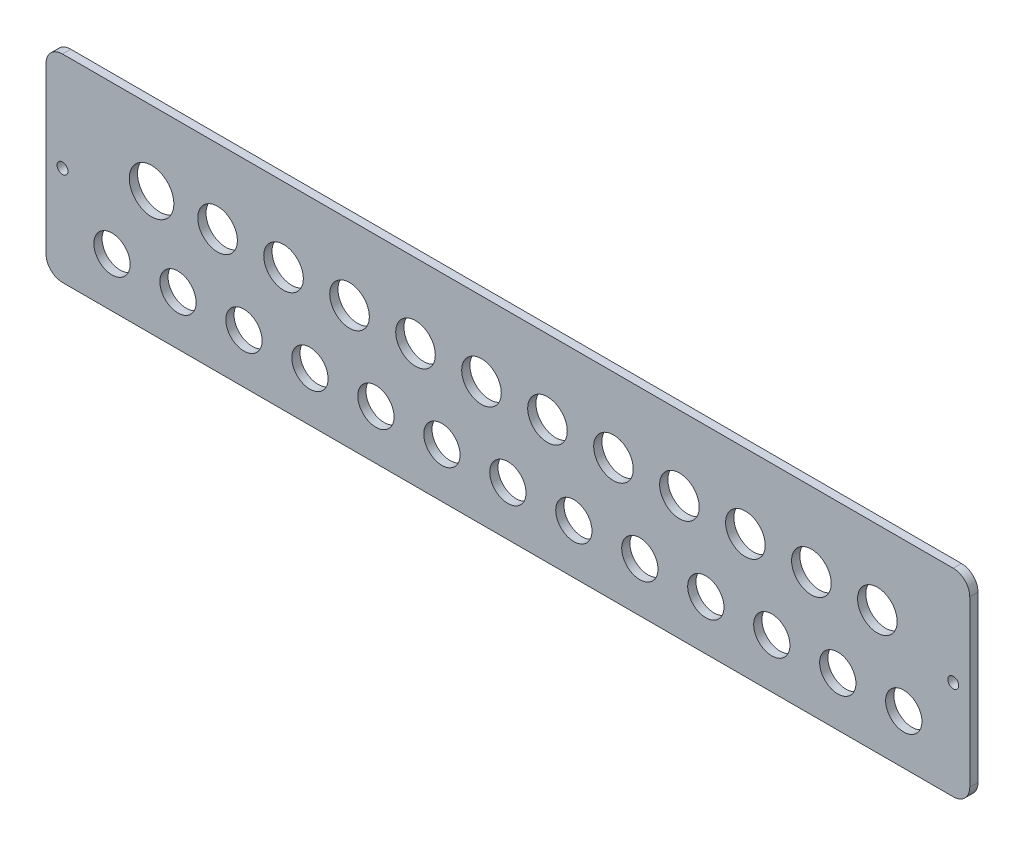
ISO-10303-21;
HEADER;
FILE_DESCRIPTION(('STEP AP214'),'2;1');
FILE_NAME('part.step','',(''),(''),'','','');
FILE_SCHEMA(('AUTOMOTIVE_DESIGN { 1 0 10303 214 1 1 1 1 }'));
ENDSEC;
DATA;
#1=APPLICATION_CONTEXT('core data for automotive mechanical design processes');
#2=APPLICATION_PROTOCOL_DEFINITION('international standard','automotive_design',2000,#1);
#3=PRODUCT_CONTEXT('',#1,'mechanical');
#4=PRODUCT('Part','Part','',(#3));
#5=PRODUCT_RELATED_PRODUCT_CATEGORY('part','',(#4));
#6=PRODUCT_DEFINITION_FORMATION('','',#4);
#7=PRODUCT_DEFINITION_CONTEXT('part definition',#1,'design');
#8=PRODUCT_DEFINITION('design','',#6,#7);
#9=PRODUCT_DEFINITION_SHAPE('','',#8);
#10=(LENGTH_UNIT() NAMED_UNIT(*) SI_UNIT(.MILLI.,.METRE.));
#11=(NAMED_UNIT(*) PLANE_ANGLE_UNIT() SI_UNIT($,.RADIAN.));
#12=(NAMED_UNIT(*) SI_UNIT($,.STERADIAN.) SOLID_ANGLE_UNIT());
#13=UNCERTAINTY_MEASURE_WITH_UNIT(LENGTH_MEASURE(1.E-05),#10,'distance_accuracy_value','');
#14=(GEOMETRIC_REPRESENTATION_CONTEXT(3) GLOBAL_UNCERTAINTY_ASSIGNED_CONTEXT((#13)) GLOBAL_UNIT_ASSIGNED_CONTEXT((#10,
#11,#12)) REPRESENTATION_CONTEXT('',''));
#15=CARTESIAN_POINT('',(0.,0.,0.));
#16=DIRECTION('',(0.,0.,1.));
#17=DIRECTION('',(1.,0.,0.));
#18=AXIS2_PLACEMENT_3D('',#15,#16,#17);
#19=CARTESIAN_POINT('',(270.,50.,5.));
#20=DIRECTION('',(0.,0.,-1.));
#21=DIRECTION('',(-1.,0.,0.));
#22=AXIS2_PLACEMENT_3D('',#19,#20,#21);
#23=CYLINDRICAL_SURFACE('',#22,10.);
#24=CARTESIAN_POINT('',(270.,50.,0.));
#25=DIRECTION('',(0.,0.,1.));
#26=DIRECTION('',(1.,0.,0.));
#27=AXIS2_PLACEMENT_3D('',#24,#25,#26);
#28=CIRCLE('',#27,10.);
#29=CARTESIAN_POINT('',(280.,50.,0.));
#30=VERTEX_POINT('',#29);
#31=CARTESIAN_POINT('',(270.,60.,0.));
#32=VERTEX_POINT('',#31);
#33=EDGE_CURVE('E132',#30,#32,#28,.T.);
#34=ORIENTED_EDGE('',*,*,#33,.T.);
#35=DIRECTION('',(0.,0.,-1.));
#36=VECTOR('',#35,1.);
#37=CARTESIAN_POINT('',(270.,60.,5.));
#38=LINE('',#37,#36);
#39=CARTESIAN_POINT('',(270.,60.,5.));
#40=VERTEX_POINT('',#39);
#41=EDGE_CURVE('E160',#40,#32,#38,.T.);
#42=ORIENTED_EDGE('',*,*,#41,.F.);
#43=CARTESIAN_POINT('',(270.,50.,5.));
#44=DIRECTION('',(0.,0.,1.));
#45=DIRECTION('',(1.,0.,0.));
#46=AXIS2_PLACEMENT_3D('',#43,#44,#45);
#47=CIRCLE('',#46,10.);
#48=CARTESIAN_POINT('',(280.,50.,5.));
#49=VERTEX_POINT('',#48);
#50=EDGE_CURVE('E147',#49,#40,#47,.T.);
#51=ORIENTED_EDGE('',*,*,#50,.F.);
#52=DIRECTION('',(0.,0.,-1.));
#53=VECTOR('',#52,1.);
#54=CARTESIAN_POINT('',(280.,50.,5.));
#55=LINE('',#54,#53);
#56=EDGE_CURVE('E128',#49,#30,#55,.T.);
#57=ORIENTED_EDGE('',*,*,#56,.T.);
#58=EDGE_LOOP('',(#34,#42,#51,#57));
#59=FACE_BOUND('',#58,.T.);
#60=ADVANCED_FACE('F33',(#59),#23,.T.);
#61=CARTESIAN_POINT('',(-270.,60.,5.));
#62=DIRECTION('',(0.,-1.,0.));
#63=DIRECTION('',(0.,0.,-1.));
#64=AXIS2_PLACEMENT_3D('',#61,#62,#63);
#65=PLANE('',#64);
#66=DIRECTION('',(-1.,0.,0.));
#67=VECTOR('',#66,1.);
#68=CARTESIAN_POINT('',(-270.,60.,0.));
#69=LINE('',#68,#67);
#70=CARTESIAN_POINT('',(-270.,60.,0.));
#71=VERTEX_POINT('',#70);
#72=EDGE_CURVE('E135',#32,#71,#69,.T.);
#73=ORIENTED_EDGE('',*,*,#72,.T.);
#74=DIRECTION('',(0.,0.,-1.));
#75=VECTOR('',#74,1.);
#76=CARTESIAN_POINT('',(-270.,60.,5.));
#77=LINE('',#76,#75);
#78=CARTESIAN_POINT('',(-270.,60.,5.));
#79=VERTEX_POINT('',#78);
#80=EDGE_CURVE('E157',#79,#71,#77,.T.);
#81=ORIENTED_EDGE('',*,*,#80,.F.);
#82=DIRECTION('',(-1.,0.,0.));
#83=VECTOR('',#82,1.);
#84=CARTESIAN_POINT('',(-270.,60.,5.));
#85=LINE('',#84,#83);
#86=EDGE_CURVE('E94',#40,#79,#85,.T.);
#87=ORIENTED_EDGE('',*,*,#86,.F.);
#88=ORIENTED_EDGE('',*,*,#41,.T.);
#89=EDGE_LOOP('',(#73,#81,#87,#88));
#90=FACE_BOUND('',#89,.T.);
#91=ADVANCED_FACE('F304',(#90),#65,.F.);
#92=CARTESIAN_POINT('',(-270.,50.,5.));
#93=DIRECTION('',(0.,0.,-1.));
#94=DIRECTION('',(-1.,0.,0.));
#95=AXIS2_PLACEMENT_3D('',#92,#93,#94);
#96=CYLINDRICAL_SURFACE('',#95,10.);
#97=CARTESIAN_POINT('',(-270.,50.,0.));
#98=DIRECTION('',(0.,0.,1.));
#99=DIRECTION('',(-1.,0.,0.));
#100=AXIS2_PLACEMENT_3D('',#97,#98,#99);
#101=CIRCLE('',#100,10.);
#102=CARTESIAN_POINT('',(-280.,50.,0.));
#103=VERTEX_POINT('',#102);
#104=EDGE_CURVE('E138',#71,#103,#101,.T.);
#105=ORIENTED_EDGE('',*,*,#104,.T.);
#106=DIRECTION('',(0.,0.,-1.));
#107=VECTOR('',#106,1.);
#108=CARTESIAN_POINT('',(-280.,50.,5.));
#109=LINE('',#108,#107);
#110=CARTESIAN_POINT('',(-280.,50.,5.));
#111=VERTEX_POINT('',#110);
#112=EDGE_CURVE('E154',#111,#103,#109,.T.);
#113=ORIENTED_EDGE('',*,*,#112,.F.);
#114=CARTESIAN_POINT('',(-270.,50.,5.));
#115=DIRECTION('',(0.,0.,1.));
#116=DIRECTION('',(-1.,0.,0.));
#117=AXIS2_PLACEMENT_3D('',#114,#115,#116);
#118=CIRCLE('',#117,10.);
#119=EDGE_CURVE('E497',#79,#111,#118,.T.);
#120=ORIENTED_EDGE('',*,*,#119,.F.);
#121=ORIENTED_EDGE('',*,*,#80,.T.);
#122=EDGE_LOOP('',(#105,#113,#120,#121));
#123=FACE_BOUND('',#122,.T.);
#124=ADVANCED_FACE('F310',(#123),#96,.T.);
#125=CARTESIAN_POINT('',(-280.,-50.,5.));
#126=DIRECTION('',(1.,0.,0.));
#127=DIRECTION('',(0.,0.,-1.));
#128=AXIS2_PLACEMENT_3D('',#125,#126,#127);
#129=PLANE('',#128);
#130=DIRECTION('',(0.,-1.,0.));
#131=VECTOR('',#130,1.);
#132=CARTESIAN_POINT('',(-280.,-50.,0.));
#133=LINE('',#132,#131);
#134=CARTESIAN_POINT('',(-280.,-50.,0.));
#135=VERTEX_POINT('',#134);
#136=EDGE_CURVE('E140',#103,#135,#133,.T.);
#137=ORIENTED_EDGE('',*,*,#136,.T.);
#138=DIRECTION('',(0.,0.,-1.));
#139=VECTOR('',#138,1.);
#140=CARTESIAN_POINT('',(-280.,-50.,5.));
#141=LINE('',#140,#139);
#142=CARTESIAN_POINT('',(-280.,-50.,5.));
#143=VERTEX_POINT('',#142);
#144=EDGE_CURVE('E151',#143,#135,#141,.T.);
#145=ORIENTED_EDGE('',*,*,#144,.F.);
#146=DIRECTION('',(0.,-1.,0.));
#147=VECTOR('',#146,1.);
#148=CARTESIAN_POINT('',(-280.,-50.,5.));
#149=LINE('',#148,#147);
#150=EDGE_CURVE('E503',#111,#143,#149,.T.);
#151=ORIENTED_EDGE('',*,*,#150,.F.);
#152=ORIENTED_EDGE('',*,*,#112,.T.);
#153=EDGE_LOOP('',(#137,#145,#151,#152));
#154=FACE_BOUND('',#153,.T.);
#155=ADVANCED_FACE('F509',(#154),#129,.F.);
#156=CARTESIAN_POINT('',(-270.,-50.,5.));
#157=DIRECTION('',(0.,0.,-1.));
#158=DIRECTION('',(-1.,0.,0.));
#159=AXIS2_PLACEMENT_3D('',#156,#157,#158);
#160=CYLINDRICAL_SURFACE('',#159,10.);
#161=CARTESIAN_POINT('',(-270.,-50.,0.));
#162=DIRECTION('',(0.,0.,1.));
#163=DIRECTION('',(-1.,0.,0.));
#164=AXIS2_PLACEMENT_3D('',#161,#162,#163);
#165=CIRCLE('',#164,10.);
#166=CARTESIAN_POINT('',(-270.,-60.,0.));
#167=VERTEX_POINT('',#166);
#168=EDGE_CURVE('E142',#135,#167,#165,.T.);
#169=ORIENTED_EDGE('',*,*,#168,.T.);
#170=DIRECTION('',(0.,0.,-1.));
#171=VECTOR('',#170,1.);
#172=CARTESIAN_POINT('',(-270.,-60.,5.));
#173=LINE('',#172,#171);
#174=CARTESIAN_POINT('',(-270.,-60.,5.));
#175=VERTEX_POINT('',#174);
#176=EDGE_CURVE('E123',#175,#167,#173,.T.);
#177=ORIENTED_EDGE('',*,*,#176,.F.);
#178=CARTESIAN_POINT('',(-270.,-50.,5.));
#179=DIRECTION('',(0.,0.,1.));
#180=DIRECTION('',(-1.,0.,0.));
#181=AXIS2_PLACEMENT_3D('',#178,#179,#180);
#182=CIRCLE('',#181,10.);
#183=EDGE_CURVE('E114',#143,#175,#182,.T.);
#184=ORIENTED_EDGE('',*,*,#183,.F.);
#185=ORIENTED_EDGE('',*,*,#144,.T.);
#186=EDGE_LOOP('',(#169,#177,#184,#185));
#187=FACE_BOUND('',#186,.T.);
#188=ADVANCED_FACE('F513',(#187),#160,.T.);
#189=CARTESIAN_POINT('',(-270.,-60.,5.));
#190=DIRECTION('',(0.,1.,0.));
#191=DIRECTION('',(0.,0.,1.));
#192=AXIS2_PLACEMENT_3D('',#189,#190,#191);
#193=PLANE('',#192);
#194=DIRECTION('',(1.,0.,0.));
#195=VECTOR('',#194,1.);
#196=CARTESIAN_POINT('',(-270.,-60.,0.));
#197=LINE('',#196,#195);
#198=CARTESIAN_POINT('',(270.,-60.,0.));
#199=VERTEX_POINT('',#198);
#200=EDGE_CURVE('E122',#167,#199,#197,.T.);
#201=ORIENTED_EDGE('',*,*,#200,.T.);
#202=DIRECTION('',(0.,0.,-1.));
#203=VECTOR('',#202,1.);
#204=CARTESIAN_POINT('',(270.,-60.,5.));
#205=LINE('',#204,#203);
#206=CARTESIAN_POINT('',(270.,-60.,5.));
#207=VERTEX_POINT('',#206);
#208=EDGE_CURVE('E119',#207,#199,#205,.T.);
#209=ORIENTED_EDGE('',*,*,#208,.F.);
#210=DIRECTION('',(1.,0.,0.));
#211=VECTOR('',#210,1.);
#212=CARTESIAN_POINT('',(-270.,-60.,5.));
#213=LINE('',#212,#211);
#214=EDGE_CURVE('E107',#175,#207,#213,.T.);
#215=ORIENTED_EDGE('',*,*,#214,.F.);
#216=ORIENTED_EDGE('',*,*,#176,.T.);
#217=EDGE_LOOP('',(#201,#209,#215,#216));
#218=FACE_BOUND('',#217,.T.);
#219=ADVANCED_FACE('F120',(#218),#193,.F.);
#220=CARTESIAN_POINT('',(270.,-50.,5.));
#221=DIRECTION('',(0.,0.,-1.));
#222=DIRECTION('',(-1.,0.,0.));
#223=AXIS2_PLACEMENT_3D('',#220,#221,#222);
#224=CYLINDRICAL_SURFACE('',#223,10.);
#225=CARTESIAN_POINT('',(270.,-50.,0.));
#226=DIRECTION('',(0.,0.,1.));
#227=DIRECTION('',(1.,0.,0.));
#228=AXIS2_PLACEMENT_3D('',#225,#226,#227);
#229=CIRCLE('',#228,10.);
#230=CARTESIAN_POINT('',(280.,-50.,0.));
#231=VERTEX_POINT('',#230);
#232=EDGE_CURVE('E79',#199,#231,#229,.T.);
#233=ORIENTED_EDGE('',*,*,#232,.T.);
#234=DIRECTION('',(0.,0.,-1.));
#235=VECTOR('',#234,1.);
#236=CARTESIAN_POINT('',(280.,-50.,5.));
#237=LINE('',#236,#235);
#238=CARTESIAN_POINT('',(280.,-50.,5.));
#239=VERTEX_POINT('',#238);
#240=EDGE_CURVE('E124',#239,#231,#237,.T.);
#241=ORIENTED_EDGE('',*,*,#240,.F.);
#242=CARTESIAN_POINT('',(270.,-50.,5.));
#243=DIRECTION('',(0.,0.,1.));
#244=DIRECTION('',(1.,0.,0.));
#245=AXIS2_PLACEMENT_3D('',#242,#243,#244);
#246=CIRCLE('',#245,10.);
#247=EDGE_CURVE('E112',#207,#239,#246,.T.);
#248=ORIENTED_EDGE('',*,*,#247,.F.);
#249=ORIENTED_EDGE('',*,*,#208,.T.);
#250=EDGE_LOOP('',(#233,#241,#248,#249));
#251=FACE_BOUND('',#250,.T.);
#252=ADVANCED_FACE('F126',(#251),#224,.T.);
#253=CARTESIAN_POINT('',(280.,-50.,5.));
#254=DIRECTION('',(-1.,0.,0.));
#255=DIRECTION('',(0.,0.,1.));
#256=AXIS2_PLACEMENT_3D('',#253,#254,#255);
#257=PLANE('',#256);
#258=DIRECTION('',(0.,1.,0.));
#259=VECTOR('',#258,1.);
#260=CARTESIAN_POINT('',(280.,-50.,0.));
#261=LINE('',#260,#259);
#262=EDGE_CURVE('E85',#231,#30,#261,.T.);
#263=ORIENTED_EDGE('',*,*,#262,.T.);
#264=ORIENTED_EDGE('',*,*,#56,.F.);
#265=DIRECTION('',(0.,1.,0.));
#266=VECTOR('',#265,1.);
#267=CARTESIAN_POINT('',(280.,-50.,5.));
#268=LINE('',#267,#266);
#269=EDGE_CURVE('E50',#239,#49,#268,.T.);
#270=ORIENTED_EDGE('',*,*,#269,.F.);
#271=ORIENTED_EDGE('',*,*,#240,.T.);
#272=EDGE_LOOP('',(#263,#264,#270,#271));
#273=FACE_BOUND('',#272,.T.);
#274=ADVANCED_FACE('F289',(#273),#257,.F.);
#275=CARTESIAN_POINT('',(270.,50.,5.));
#276=DIRECTION('',(0.,0.,1.));
#277=DIRECTION('',(1.,0.,0.));
#278=AXIS2_PLACEMENT_3D('',#275,#276,#277);
#279=PLANE('',#278);
#280=CARTESIAN_POINT('',(-216.,15.,5.));
#281=DIRECTION('',(0.,0.,1.));
#282=DIRECTION('',(1.,0.,0.));
#283=AXIS2_PLACEMENT_3D('',#280,#281,#282);
#284=CIRCLE('',#283,13.5);
#285=CARTESIAN_POINT('',(-202.5,15.,5.));
#286=VERTEX_POINT('',#285);
#287=EDGE_CURVE('E760',#286,#286,#284,.T.);
#288=ORIENTED_EDGE('',*,*,#287,.F.);
#289=EDGE_LOOP('',(#288));
#290=FACE_BOUND('',#289,.T.);
#291=CARTESIAN_POINT('',(184.,15.,5.));
#292=DIRECTION('',(0.,0.,1.));
#293=DIRECTION('',(1.,0.,0.));
#294=AXIS2_PLACEMENT_3D('',#291,#292,#293);
#295=CIRCLE('',#294,12.);
#296=CARTESIAN_POINT('',(196.,15.,5.));
#297=VERTEX_POINT('',#296);
#298=EDGE_CURVE('E757',#297,#297,#295,.T.);
#299=ORIENTED_EDGE('',*,*,#298,.F.);
#300=EDGE_LOOP('',(#299));
#301=FACE_BOUND('',#300,.T.);
#302=CARTESIAN_POINT('',(224.,15.,5.));
#303=DIRECTION('',(0.,0.,1.));
#304=DIRECTION('',(1.,0.,0.));
#305=AXIS2_PLACEMENT_3D('',#302,#303,#304);
#306=CIRCLE('',#305,12.);
#307=CARTESIAN_POINT('',(236.,15.,5.));
#308=VERTEX_POINT('',#307);
#309=EDGE_CURVE('E748',#308,#308,#306,.T.);
#310=ORIENTED_EDGE('',*,*,#309,.F.);
#311=EDGE_LOOP('',(#310));
#312=FACE_BOUND('',#311,.T.);
#313=CARTESIAN_POINT('',(200.,-30.,5.));
#314=DIRECTION('',(0.,0.,1.));
#315=DIRECTION('',(1.,0.,0.));
#316=AXIS2_PLACEMENT_3D('',#313,#314,#315);
#317=CIRCLE('',#316,11.);
#318=CARTESIAN_POINT('',(211.,-30.,5.));
#319=VERTEX_POINT('',#318);
#320=EDGE_CURVE('E745',#319,#319,#317,.T.);
#321=ORIENTED_EDGE('',*,*,#320,.F.);
#322=EDGE_LOOP('',(#321));
#323=FACE_BOUND('',#322,.T.);
#324=CARTESIAN_POINT('',(240.,-30.,5.));
#325=DIRECTION('',(0.,0.,1.));
#326=DIRECTION('',(1.,0.,0.));
#327=AXIS2_PLACEMENT_3D('',#324,#325,#326);
#328=CIRCLE('',#327,11.);
#329=CARTESIAN_POINT('',(251.,-30.,5.));
#330=VERTEX_POINT('',#329);
#331=EDGE_CURVE('E736',#330,#330,#328,.T.);
#332=ORIENTED_EDGE('',*,*,#331,.F.);
#333=EDGE_LOOP('',(#332));
#334=FACE_BOUND('',#333,.T.);
#335=CARTESIAN_POINT('',(270.,-1.66186508998578E-12,5.));
#336=DIRECTION('',(0.,0.,1.));
#337=DIRECTION('',(1.,0.,0.));
#338=AXIS2_PLACEMENT_3D('',#335,#336,#337);
#339=CIRCLE('',#338,3.29999999999997);
#340=CARTESIAN_POINT('',(273.3,-1.66186508998578E-12,5.));
#341=VERTEX_POINT('',#340);
#342=EDGE_CURVE('E169',#341,#341,#339,.T.);
#343=ORIENTED_EDGE('',*,*,#342,.F.);
#344=EDGE_LOOP('',(#343));
#345=FACE_BOUND('',#344,.T.);
#346=CARTESIAN_POINT('',(-270.,-1.66186508998578E-12,5.));
#347=DIRECTION('',(0.,0.,1.));
#348=DIRECTION('',(1.,0.,0.));
#349=AXIS2_PLACEMENT_3D('',#346,#347,#348);
#350=CIRCLE('',#349,3.29999999999997);
#351=CARTESIAN_POINT('',(-266.7,-1.66186508998578E-12,5.));
#352=VERTEX_POINT('',#351);
#353=EDGE_CURVE('E165',#352,#352,#350,.T.);
#354=ORIENTED_EDGE('',*,*,#353,.F.);
#355=EDGE_LOOP('',(#354));
#356=FACE_BOUND('',#355,.T.);
#357=ORIENTED_EDGE('',*,*,#50,.T.);
#358=ORIENTED_EDGE('',*,*,#86,.T.);
#359=ORIENTED_EDGE('',*,*,#119,.T.);
#360=ORIENTED_EDGE('',*,*,#150,.T.);
#361=ORIENTED_EDGE('',*,*,#183,.T.);
#362=ORIENTED_EDGE('',*,*,#214,.T.);
#363=ORIENTED_EDGE('',*,*,#247,.T.);
#364=ORIENTED_EDGE('',*,*,#269,.T.);
#365=EDGE_LOOP('',(#357,#358,#359,#360,#361,#362,#363,#364));
#366=FACE_BOUND('',#365,.T.);
#367=CARTESIAN_POINT('',(160.,-30.,5.));
#368=DIRECTION('',(0.,0.,1.));
#369=DIRECTION('',(1.,0.,0.));
#370=AXIS2_PLACEMENT_3D('',#367,#368,#369);
#371=CIRCLE('',#370,11.);
#372=CARTESIAN_POINT('',(171.,-30.,5.));
#373=VERTEX_POINT('',#372);
#374=EDGE_CURVE('E162',#373,#373,#371,.T.);
#375=ORIENTED_EDGE('',*,*,#374,.F.);
#376=EDGE_LOOP('',(#375));
#377=FACE_BOUND('',#376,.T.);
#378=CARTESIAN_POINT('',(120.,-30.,5.));
#379=DIRECTION('',(0.,0.,1.));
#380=DIRECTION('',(1.,0.,0.));
#381=AXIS2_PLACEMENT_3D('',#378,#379,#380);
#382=CIRCLE('',#381,11.);
#383=CARTESIAN_POINT('',(131.,-30.,5.));
#384=VERTEX_POINT('',#383);
#385=EDGE_CURVE('E175',#384,#384,#382,.T.);
#386=ORIENTED_EDGE('',*,*,#385,.F.);
#387=EDGE_LOOP('',(#386));
#388=FACE_BOUND('',#387,.T.);
#389=CARTESIAN_POINT('',(80.,-30.,5.));
#390=DIRECTION('',(0.,0.,1.));
#391=DIRECTION('',(1.,0.,0.));
#392=AXIS2_PLACEMENT_3D('',#389,#390,#391);
#393=CIRCLE('',#392,11.);
#394=CARTESIAN_POINT('',(91.,-30.,5.));
#395=VERTEX_POINT('',#394);
#396=EDGE_CURVE('E181',#395,#395,#393,.T.);
#397=ORIENTED_EDGE('',*,*,#396,.F.);
#398=EDGE_LOOP('',(#397));
#399=FACE_BOUND('',#398,.T.);
#400=CARTESIAN_POINT('',(40.,-30.,5.));
#401=DIRECTION('',(0.,0.,1.));
#402=DIRECTION('',(1.,0.,0.));
#403=AXIS2_PLACEMENT_3D('',#400,#401,#402);
#404=CIRCLE('',#403,11.);
#405=CARTESIAN_POINT('',(51.,-30.,5.));
#406=VERTEX_POINT('',#405);
#407=EDGE_CURVE('E187',#406,#406,#404,.T.);
#408=ORIENTED_EDGE('',*,*,#407,.F.);
#409=EDGE_LOOP('',(#408));
#410=FACE_BOUND('',#409,.T.);
#411=CARTESIAN_POINT('',(0.,-30.,5.));
#412=DIRECTION('',(0.,0.,1.));
#413=DIRECTION('',(1.,0.,0.));
#414=AXIS2_PLACEMENT_3D('',#411,#412,#413);
#415=CIRCLE('',#414,11.);
#416=CARTESIAN_POINT('',(11.,-30.,5.));
#417=VERTEX_POINT('',#416);
#418=EDGE_CURVE('E193',#417,#417,#415,.T.);
#419=ORIENTED_EDGE('',*,*,#418,.F.);
#420=EDGE_LOOP('',(#419));
#421=FACE_BOUND('',#420,.T.);
#422=CARTESIAN_POINT('',(-40.,-30.,5.));
#423=DIRECTION('',(0.,0.,1.));
#424=DIRECTION('',(1.,0.,0.));
#425=AXIS2_PLACEMENT_3D('',#422,#423,#424);
#426=CIRCLE('',#425,11.);
#427=CARTESIAN_POINT('',(-29.,-30.,5.));
#428=VERTEX_POINT('',#427);
#429=EDGE_CURVE('E199',#428,#428,#426,.T.);
#430=ORIENTED_EDGE('',*,*,#429,.F.);
#431=EDGE_LOOP('',(#430));
#432=FACE_BOUND('',#431,.T.);
#433=CARTESIAN_POINT('',(-80.,-30.,5.));
#434=DIRECTION('',(0.,0.,1.));
#435=DIRECTION('',(1.,0.,0.));
#436=AXIS2_PLACEMENT_3D('',#433,#434,#435);
#437=CIRCLE('',#436,11.);
#438=CARTESIAN_POINT('',(-69.,-30.,5.));
#439=VERTEX_POINT('',#438);
#440=EDGE_CURVE('E205',#439,#439,#437,.T.);
#441=ORIENTED_EDGE('',*,*,#440,.F.);
#442=EDGE_LOOP('',(#441));
#443=FACE_BOUND('',#442,.T.);
#444=CARTESIAN_POINT('',(-120.,-30.,5.));
#445=DIRECTION('',(0.,0.,1.));
#446=DIRECTION('',(1.,0.,0.));
#447=AXIS2_PLACEMENT_3D('',#444,#445,#446);
#448=CIRCLE('',#447,11.);
#449=CARTESIAN_POINT('',(-109.,-30.,5.));
#450=VERTEX_POINT('',#449);
#451=EDGE_CURVE('E211',#450,#450,#448,.T.);
#452=ORIENTED_EDGE('',*,*,#451,.F.);
#453=EDGE_LOOP('',(#452));
#454=FACE_BOUND('',#453,.T.);
#455=CARTESIAN_POINT('',(-160.,-30.,5.));
#456=DIRECTION('',(0.,0.,1.));
#457=DIRECTION('',(1.,0.,0.));
#458=AXIS2_PLACEMENT_3D('',#455,#456,#457);
#459=CIRCLE('',#458,11.);
#460=CARTESIAN_POINT('',(-149.,-30.,5.));
#461=VERTEX_POINT('',#460);
#462=EDGE_CURVE('E217',#461,#461,#459,.T.);
#463=ORIENTED_EDGE('',*,*,#462,.F.);
#464=EDGE_LOOP('',(#463));
#465=FACE_BOUND('',#464,.T.);
#466=CARTESIAN_POINT('',(-200.,-30.,5.));
#467=DIRECTION('',(0.,0.,1.));
#468=DIRECTION('',(1.,0.,0.));
#469=AXIS2_PLACEMENT_3D('',#466,#467,#468);
#470=CIRCLE('',#469,11.);
#471=CARTESIAN_POINT('',(-189.,-30.,5.));
#472=VERTEX_POINT('',#471);
#473=EDGE_CURVE('E223',#472,#472,#470,.T.);
#474=ORIENTED_EDGE('',*,*,#473,.F.);
#475=EDGE_LOOP('',(#474));
#476=FACE_BOUND('',#475,.T.);
#477=CARTESIAN_POINT('',(-240.,-30.,5.));
#478=DIRECTION('',(0.,0.,1.));
#479=DIRECTION('',(1.,0.,0.));
#480=AXIS2_PLACEMENT_3D('',#477,#478,#479);
#481=CIRCLE('',#480,11.);
#482=CARTESIAN_POINT('',(-229.,-30.,5.));
#483=VERTEX_POINT('',#482);
#484=EDGE_CURVE('E229',#483,#483,#481,.T.);
#485=ORIENTED_EDGE('',*,*,#484,.F.);
#486=EDGE_LOOP('',(#485));
#487=FACE_BOUND('',#486,.T.);
#488=CARTESIAN_POINT('',(144.,15.,5.));
#489=DIRECTION('',(0.,0.,1.));
#490=DIRECTION('',(1.,0.,0.));
#491=AXIS2_PLACEMENT_3D('',#488,#489,#490);
#492=CIRCLE('',#491,12.);
#493=CARTESIAN_POINT('',(156.,15.,5.));
#494=VERTEX_POINT('',#493);
#495=EDGE_CURVE('E235',#494,#494,#492,.T.);
#496=ORIENTED_EDGE('',*,*,#495,.F.);
#497=EDGE_LOOP('',(#496));
#498=FACE_BOUND('',#497,.T.);
#499=CARTESIAN_POINT('',(104.,15.,5.));
#500=DIRECTION('',(0.,0.,1.));
#501=DIRECTION('',(1.,0.,0.));
#502=AXIS2_PLACEMENT_3D('',#499,#500,#501);
#503=CIRCLE('',#502,12.);
#504=CARTESIAN_POINT('',(116.,15.,5.));
#505=VERTEX_POINT('',#504);
#506=EDGE_CURVE('E241',#505,#505,#503,.T.);
#507=ORIENTED_EDGE('',*,*,#506,.F.);
#508=EDGE_LOOP('',(#507));
#509=FACE_BOUND('',#508,.T.);
#510=CARTESIAN_POINT('',(64.,15.,5.));
#511=DIRECTION('',(0.,0.,1.));
#512=DIRECTION('',(1.,0.,0.));
#513=AXIS2_PLACEMENT_3D('',#510,#511,#512);
#514=CIRCLE('',#513,12.);
#515=CARTESIAN_POINT('',(76.,15.,5.));
#516=VERTEX_POINT('',#515);
#517=EDGE_CURVE('E247',#516,#516,#514,.T.);
#518=ORIENTED_EDGE('',*,*,#517,.F.);
#519=EDGE_LOOP('',(#518));
#520=FACE_BOUND('',#519,.T.);
#521=CARTESIAN_POINT('',(24.,15.,5.));
#522=DIRECTION('',(0.,0.,1.));
#523=DIRECTION('',(1.,0.,0.));
#524=AXIS2_PLACEMENT_3D('',#521,#522,#523);
#525=CIRCLE('',#524,12.);
#526=CARTESIAN_POINT('',(36.,15.,5.));
#527=VERTEX_POINT('',#526);
#528=EDGE_CURVE('E253',#527,#527,#525,.T.);
#529=ORIENTED_EDGE('',*,*,#528,.F.);
#530=EDGE_LOOP('',(#529));
#531=FACE_BOUND('',#530,.T.);
#532=CARTESIAN_POINT('',(-16.,15.,5.));
#533=DIRECTION('',(0.,0.,1.));
#534=DIRECTION('',(1.,0.,0.));
#535=AXIS2_PLACEMENT_3D('',#532,#533,#534);
#536=CIRCLE('',#535,12.);
#537=CARTESIAN_POINT('',(-3.99999999999995,15.,5.));
#538=VERTEX_POINT('',#537);
#539=EDGE_CURVE('E259',#538,#538,#536,.T.);
#540=ORIENTED_EDGE('',*,*,#539,.F.);
#541=EDGE_LOOP('',(#540));
#542=FACE_BOUND('',#541,.T.);
#543=CARTESIAN_POINT('',(-56.,15.,5.));
#544=DIRECTION('',(0.,0.,1.));
#545=DIRECTION('',(1.,0.,0.));
#546=AXIS2_PLACEMENT_3D('',#543,#544,#545);
#547=CIRCLE('',#546,12.);
#548=CARTESIAN_POINT('',(-44.,15.,5.));
#549=VERTEX_POINT('',#548);
#550=EDGE_CURVE('E265',#549,#549,#547,.T.);
#551=ORIENTED_EDGE('',*,*,#550,.F.);
#552=EDGE_LOOP('',(#551));
#553=FACE_BOUND('',#552,.T.);
#554=CARTESIAN_POINT('',(-96.,15.,5.));
#555=DIRECTION('',(0.,0.,1.));
#556=DIRECTION('',(1.,0.,0.));
#557=AXIS2_PLACEMENT_3D('',#554,#555,#556);
#558=CIRCLE('',#557,12.);
#559=CARTESIAN_POINT('',(-84.,15.,5.));
#560=VERTEX_POINT('',#559);
#561=EDGE_CURVE('E271',#560,#560,#558,.T.);
#562=ORIENTED_EDGE('',*,*,#561,.F.);
#563=EDGE_LOOP('',(#562));
#564=FACE_BOUND('',#563,.T.);
#565=CARTESIAN_POINT('',(-136.,15.,5.));
#566=DIRECTION('',(0.,0.,1.));
#567=DIRECTION('',(1.,0.,0.));
#568=AXIS2_PLACEMENT_3D('',#565,#566,#567);
#569=CIRCLE('',#568,12.);
#570=CARTESIAN_POINT('',(-124.,15.,5.));
#571=VERTEX_POINT('',#570);
#572=EDGE_CURVE('E277',#571,#571,#569,.T.);
#573=ORIENTED_EDGE('',*,*,#572,.F.);
#574=EDGE_LOOP('',(#573));
#575=FACE_BOUND('',#574,.T.);
#576=CARTESIAN_POINT('',(-176.,15.,5.));
#577=DIRECTION('',(0.,0.,1.));
#578=DIRECTION('',(1.,0.,0.));
#579=AXIS2_PLACEMENT_3D('',#576,#577,#578);
#580=CIRCLE('',#579,12.);
#581=CARTESIAN_POINT('',(-164.,15.,5.));
#582=VERTEX_POINT('',#581);
#583=EDGE_CURVE('E42',#582,#582,#580,.T.);
#584=ORIENTED_EDGE('',*,*,#583,.F.);
#585=EDGE_LOOP('',(#584));
#586=FACE_BOUND('',#585,.T.);
#587=ADVANCED_FACE('F109',(#290,#301,#312,#323,#334,#345,#356,#366,#377,#388,#399,#410,#421,
#432,#443,#454,#465,#476,#487,#498,#509,#520,#531,#542,#553,#564,#575,#586),#279,.T.);
#588=CARTESIAN_POINT('',(270.,50.,0.));
#589=DIRECTION('',(0.,0.,1.));
#590=DIRECTION('',(1.,0.,0.));
#591=AXIS2_PLACEMENT_3D('',#588,#589,#590);
#592=PLANE('',#591);
#593=CARTESIAN_POINT('',(-216.,15.,0.));
#594=DIRECTION('',(0.,0.,-1.));
#595=DIRECTION('',(-1.,0.,0.));
#596=AXIS2_PLACEMENT_3D('',#593,#594,#595);
#597=CIRCLE('',#596,13.5);
#598=CARTESIAN_POINT('',(-229.5,15.,0.));
#599=VERTEX_POINT('',#598);
#600=EDGE_CURVE('E762',#599,#599,#597,.T.);
#601=ORIENTED_EDGE('',*,*,#600,.F.);
#602=EDGE_LOOP('',(#601));
#603=FACE_BOUND('',#602,.T.);
#604=CARTESIAN_POINT('',(184.,15.,0.));
#605=DIRECTION('',(0.,0.,-1.));
#606=DIRECTION('',(-1.,0.,0.));
#607=AXIS2_PLACEMENT_3D('',#604,#605,#606);
#608=CIRCLE('',#607,12.);
#609=CARTESIAN_POINT('',(172.,15.,0.));
#610=VERTEX_POINT('',#609);
#611=EDGE_CURVE('E754',#610,#610,#608,.T.);
#612=ORIENTED_EDGE('',*,*,#611,.F.);
#613=EDGE_LOOP('',(#612));
#614=FACE_BOUND('',#613,.T.);
#615=CARTESIAN_POINT('',(224.,15.,0.));
#616=DIRECTION('',(0.,0.,-1.));
#617=DIRECTION('',(-1.,0.,0.));
#618=AXIS2_PLACEMENT_3D('',#615,#616,#617);
#619=CIRCLE('',#618,12.);
#620=CARTESIAN_POINT('',(212.,15.,0.));
#621=VERTEX_POINT('',#620);
#622=EDGE_CURVE('E751',#621,#621,#619,.T.);
#623=ORIENTED_EDGE('',*,*,#622,.F.);
#624=EDGE_LOOP('',(#623));
#625=FACE_BOUND('',#624,.T.);
#626=CARTESIAN_POINT('',(200.,-30.,0.));
#627=DIRECTION('',(0.,0.,-1.));
#628=DIRECTION('',(-1.,0.,0.));
#629=AXIS2_PLACEMENT_3D('',#626,#627,#628);
#630=CIRCLE('',#629,11.);
#631=CARTESIAN_POINT('',(189.,-30.,0.));
#632=VERTEX_POINT('',#631);
#633=EDGE_CURVE('E742',#632,#632,#630,.T.);
#634=ORIENTED_EDGE('',*,*,#633,.F.);
#635=EDGE_LOOP('',(#634));
#636=FACE_BOUND('',#635,.T.);
#637=CARTESIAN_POINT('',(240.,-30.,0.));
#638=DIRECTION('',(0.,0.,-1.));
#639=DIRECTION('',(-1.,0.,0.));
#640=AXIS2_PLACEMENT_3D('',#637,#638,#639);
#641=CIRCLE('',#640,11.);
#642=CARTESIAN_POINT('',(229.,-30.,0.));
#643=VERTEX_POINT('',#642);
#644=EDGE_CURVE('E739',#643,#643,#641,.T.);
#645=ORIENTED_EDGE('',*,*,#644,.F.);
#646=EDGE_LOOP('',(#645));
#647=FACE_BOUND('',#646,.T.);
#648=CARTESIAN_POINT('',(270.,-1.66186508998578E-12,0.));
#649=DIRECTION('',(0.,0.,1.));
#650=DIRECTION('',(1.,0.,0.));
#651=AXIS2_PLACEMENT_3D('',#648,#649,#650);
#652=CIRCLE('',#651,3.29999999999997);
#653=CARTESIAN_POINT('',(273.3,-1.66186508998578E-12,0.));
#654=VERTEX_POINT('',#653);
#655=EDGE_CURVE('E166',#654,#654,#652,.T.);
#656=ORIENTED_EDGE('',*,*,#655,.T.);
#657=EDGE_LOOP('',(#656));
#658=FACE_BOUND('',#657,.T.);
#659=CARTESIAN_POINT('',(-270.,-1.66186508998578E-12,0.));
#660=DIRECTION('',(0.,0.,1.));
#661=DIRECTION('',(1.,0.,0.));
#662=AXIS2_PLACEMENT_3D('',#659,#660,#661);
#663=CIRCLE('',#662,3.29999999999997);
#664=CARTESIAN_POINT('',(-266.7,-1.66186508998578E-12,0.));
#665=VERTEX_POINT('',#664);
#666=EDGE_CURVE('E136',#665,#665,#663,.T.);
#667=ORIENTED_EDGE('',*,*,#666,.T.);
#668=EDGE_LOOP('',(#667));
#669=FACE_BOUND('',#668,.T.);
#670=ORIENTED_EDGE('',*,*,#33,.F.);
#671=ORIENTED_EDGE('',*,*,#262,.F.);
#672=ORIENTED_EDGE('',*,*,#232,.F.);
#673=ORIENTED_EDGE('',*,*,#200,.F.);
#674=ORIENTED_EDGE('',*,*,#168,.F.);
#675=ORIENTED_EDGE('',*,*,#136,.F.);
#676=ORIENTED_EDGE('',*,*,#104,.F.);
#677=ORIENTED_EDGE('',*,*,#72,.F.);
#678=EDGE_LOOP('',(#670,#671,#672,#673,#674,#675,#676,#677));
#679=FACE_BOUND('',#678,.T.);
#680=CARTESIAN_POINT('',(160.,-30.,0.));
#681=DIRECTION('',(0.,0.,-1.));
#682=DIRECTION('',(-1.,0.,0.));
#683=AXIS2_PLACEMENT_3D('',#680,#681,#682);
#684=CIRCLE('',#683,11.);
#685=CARTESIAN_POINT('',(149.,-30.,0.));
#686=VERTEX_POINT('',#685);
#687=EDGE_CURVE('E172',#686,#686,#684,.T.);
#688=ORIENTED_EDGE('',*,*,#687,.F.);
#689=EDGE_LOOP('',(#688));
#690=FACE_BOUND('',#689,.T.);
#691=CARTESIAN_POINT('',(120.,-30.,0.));
#692=DIRECTION('',(0.,0.,-1.));
#693=DIRECTION('',(-1.,0.,0.));
#694=AXIS2_PLACEMENT_3D('',#691,#692,#693);
#695=CIRCLE('',#694,11.);
#696=CARTESIAN_POINT('',(109.,-30.,0.));
#697=VERTEX_POINT('',#696);
#698=EDGE_CURVE('E178',#697,#697,#695,.T.);
#699=ORIENTED_EDGE('',*,*,#698,.F.);
#700=EDGE_LOOP('',(#699));
#701=FACE_BOUND('',#700,.T.);
#702=CARTESIAN_POINT('',(80.,-30.,0.));
#703=DIRECTION('',(0.,0.,-1.));
#704=DIRECTION('',(-1.,0.,0.));
#705=AXIS2_PLACEMENT_3D('',#702,#703,#704);
#706=CIRCLE('',#705,11.);
#707=CARTESIAN_POINT('',(69.,-30.,0.));
#708=VERTEX_POINT('',#707);
#709=EDGE_CURVE('E184',#708,#708,#706,.T.);
#710=ORIENTED_EDGE('',*,*,#709,.F.);
#711=EDGE_LOOP('',(#710));
#712=FACE_BOUND('',#711,.T.);
#713=CARTESIAN_POINT('',(40.,-30.,0.));
#714=DIRECTION('',(0.,0.,-1.));
#715=DIRECTION('',(-1.,0.,0.));
#716=AXIS2_PLACEMENT_3D('',#713,#714,#715);
#717=CIRCLE('',#716,11.);
#718=CARTESIAN_POINT('',(29.,-30.,0.));
#719=VERTEX_POINT('',#718);
#720=EDGE_CURVE('E190',#719,#719,#717,.T.);
#721=ORIENTED_EDGE('',*,*,#720,.F.);
#722=EDGE_LOOP('',(#721));
#723=FACE_BOUND('',#722,.T.);
#724=CARTESIAN_POINT('',(0.,-30.,0.));
#725=DIRECTION('',(0.,0.,-1.));
#726=DIRECTION('',(-1.,0.,0.));
#727=AXIS2_PLACEMENT_3D('',#724,#725,#726);
#728=CIRCLE('',#727,11.);
#729=CARTESIAN_POINT('',(-11.,-30.,0.));
#730=VERTEX_POINT('',#729);
#731=EDGE_CURVE('E196',#730,#730,#728,.T.);
#732=ORIENTED_EDGE('',*,*,#731,.F.);
#733=EDGE_LOOP('',(#732));
#734=FACE_BOUND('',#733,.T.);
#735=CARTESIAN_POINT('',(-40.,-30.,0.));
#736=DIRECTION('',(0.,0.,-1.));
#737=DIRECTION('',(-1.,0.,0.));
#738=AXIS2_PLACEMENT_3D('',#735,#736,#737);
#739=CIRCLE('',#738,11.);
#740=CARTESIAN_POINT('',(-51.,-30.,0.));
#741=VERTEX_POINT('',#740);
#742=EDGE_CURVE('E202',#741,#741,#739,.T.);
#743=ORIENTED_EDGE('',*,*,#742,.F.);
#744=EDGE_LOOP('',(#743));
#745=FACE_BOUND('',#744,.T.);
#746=CARTESIAN_POINT('',(-80.,-30.,0.));
#747=DIRECTION('',(0.,0.,-1.));
#748=DIRECTION('',(-1.,0.,0.));
#749=AXIS2_PLACEMENT_3D('',#746,#747,#748);
#750=CIRCLE('',#749,11.);
#751=CARTESIAN_POINT('',(-91.0000000000001,-30.,0.));
#752=VERTEX_POINT('',#751);
#753=EDGE_CURVE('E208',#752,#752,#750,.T.);
#754=ORIENTED_EDGE('',*,*,#753,.F.);
#755=EDGE_LOOP('',(#754));
#756=FACE_BOUND('',#755,.T.);
#757=CARTESIAN_POINT('',(-120.,-30.,0.));
#758=DIRECTION('',(0.,0.,-1.));
#759=DIRECTION('',(-1.,0.,0.));
#760=AXIS2_PLACEMENT_3D('',#757,#758,#759);
#761=CIRCLE('',#760,11.);
#762=CARTESIAN_POINT('',(-131.,-30.,0.));
#763=VERTEX_POINT('',#762);
#764=EDGE_CURVE('E214',#763,#763,#761,.T.);
#765=ORIENTED_EDGE('',*,*,#764,.F.);
#766=EDGE_LOOP('',(#765));
#767=FACE_BOUND('',#766,.T.);
#768=CARTESIAN_POINT('',(-160.,-30.,0.));
#769=DIRECTION('',(0.,0.,-1.));
#770=DIRECTION('',(-1.,0.,0.));
#771=AXIS2_PLACEMENT_3D('',#768,#769,#770);
#772=CIRCLE('',#771,11.);
#773=CARTESIAN_POINT('',(-171.,-30.,0.));
#774=VERTEX_POINT('',#773);
#775=EDGE_CURVE('E220',#774,#774,#772,.T.);
#776=ORIENTED_EDGE('',*,*,#775,.F.);
#777=EDGE_LOOP('',(#776));
#778=FACE_BOUND('',#777,.T.);
#779=CARTESIAN_POINT('',(-200.,-30.,0.));
#780=DIRECTION('',(0.,0.,-1.));
#781=DIRECTION('',(-1.,0.,0.));
#782=AXIS2_PLACEMENT_3D('',#779,#780,#781);
#783=CIRCLE('',#782,11.);
#784=CARTESIAN_POINT('',(-211.,-30.,0.));
#785=VERTEX_POINT('',#784);
#786=EDGE_CURVE('E226',#785,#785,#783,.T.);
#787=ORIENTED_EDGE('',*,*,#786,.F.);
#788=EDGE_LOOP('',(#787));
#789=FACE_BOUND('',#788,.T.);
#790=CARTESIAN_POINT('',(-240.,-30.,0.));
#791=DIRECTION('',(0.,0.,-1.));
#792=DIRECTION('',(-1.,0.,0.));
#793=AXIS2_PLACEMENT_3D('',#790,#791,#792);
#794=CIRCLE('',#793,11.);
#795=CARTESIAN_POINT('',(-251.,-30.,0.));
#796=VERTEX_POINT('',#795);
#797=EDGE_CURVE('E232',#796,#796,#794,.T.);
#798=ORIENTED_EDGE('',*,*,#797,.F.);
#799=EDGE_LOOP('',(#798));
#800=FACE_BOUND('',#799,.T.);
#801=CARTESIAN_POINT('',(144.,15.,0.));
#802=DIRECTION('',(0.,0.,-1.));
#803=DIRECTION('',(-1.,0.,0.));
#804=AXIS2_PLACEMENT_3D('',#801,#802,#803);
#805=CIRCLE('',#804,12.);
#806=CARTESIAN_POINT('',(132.,15.,0.));
#807=VERTEX_POINT('',#806);
#808=EDGE_CURVE('E238',#807,#807,#805,.T.);
#809=ORIENTED_EDGE('',*,*,#808,.F.);
#810=EDGE_LOOP('',(#809));
#811=FACE_BOUND('',#810,.T.);
#812=CARTESIAN_POINT('',(104.,15.,0.));
#813=DIRECTION('',(0.,0.,-1.));
#814=DIRECTION('',(-1.,0.,0.));
#815=AXIS2_PLACEMENT_3D('',#812,#813,#814);
#816=CIRCLE('',#815,12.);
#817=CARTESIAN_POINT('',(92.,15.,0.));
#818=VERTEX_POINT('',#817);
#819=EDGE_CURVE('E244',#818,#818,#816,.T.);
#820=ORIENTED_EDGE('',*,*,#819,.F.);
#821=EDGE_LOOP('',(#820));
#822=FACE_BOUND('',#821,.T.);
#823=CARTESIAN_POINT('',(64.,15.,0.));
#824=DIRECTION('',(0.,0.,-1.));
#825=DIRECTION('',(-1.,0.,0.));
#826=AXIS2_PLACEMENT_3D('',#823,#824,#825);
#827=CIRCLE('',#826,12.);
#828=CARTESIAN_POINT('',(52.,15.,0.));
#829=VERTEX_POINT('',#828);
#830=EDGE_CURVE('E250',#829,#829,#827,.T.);
#831=ORIENTED_EDGE('',*,*,#830,.F.);
#832=EDGE_LOOP('',(#831));
#833=FACE_BOUND('',#832,.T.);
#834=CARTESIAN_POINT('',(24.,15.,0.));
#835=DIRECTION('',(0.,0.,-1.));
#836=DIRECTION('',(-1.,0.,0.));
#837=AXIS2_PLACEMENT_3D('',#834,#835,#836);
#838=CIRCLE('',#837,12.);
#839=CARTESIAN_POINT('',(12.,15.,0.));
#840=VERTEX_POINT('',#839);
#841=EDGE_CURVE('E256',#840,#840,#838,.T.);
#842=ORIENTED_EDGE('',*,*,#841,.F.);
#843=EDGE_LOOP('',(#842));
#844=FACE_BOUND('',#843,.T.);
#845=CARTESIAN_POINT('',(-16.,15.,0.));
#846=DIRECTION('',(0.,0.,-1.));
#847=DIRECTION('',(-1.,0.,0.));
#848=AXIS2_PLACEMENT_3D('',#845,#846,#847);
#849=CIRCLE('',#848,12.);
#850=CARTESIAN_POINT('',(-28.,15.,0.));
#851=VERTEX_POINT('',#850);
#852=EDGE_CURVE('E262',#851,#851,#849,.T.);
#853=ORIENTED_EDGE('',*,*,#852,.F.);
#854=EDGE_LOOP('',(#853));
#855=FACE_BOUND('',#854,.T.);
#856=CARTESIAN_POINT('',(-56.,15.,0.));
#857=DIRECTION('',(0.,0.,-1.));
#858=DIRECTION('',(-1.,0.,0.));
#859=AXIS2_PLACEMENT_3D('',#856,#857,#858);
#860=CIRCLE('',#859,12.);
#861=CARTESIAN_POINT('',(-68.,15.,0.));
#862=VERTEX_POINT('',#861);
#863=EDGE_CURVE('E268',#862,#862,#860,.T.);
#864=ORIENTED_EDGE('',*,*,#863,.F.);
#865=EDGE_LOOP('',(#864));
#866=FACE_BOUND('',#865,.T.);
#867=CARTESIAN_POINT('',(-96.,15.,0.));
#868=DIRECTION('',(0.,0.,-1.));
#869=DIRECTION('',(-1.,0.,0.));
#870=AXIS2_PLACEMENT_3D('',#867,#868,#869);
#871=CIRCLE('',#870,12.);
#872=CARTESIAN_POINT('',(-108.,15.,0.));
#873=VERTEX_POINT('',#872);
#874=EDGE_CURVE('E274',#873,#873,#871,.T.);
#875=ORIENTED_EDGE('',*,*,#874,.F.);
#876=EDGE_LOOP('',(#875));
#877=FACE_BOUND('',#876,.T.);
#878=CARTESIAN_POINT('',(-136.,15.,0.));
#879=DIRECTION('',(0.,0.,-1.));
#880=DIRECTION('',(-1.,0.,0.));
#881=AXIS2_PLACEMENT_3D('',#878,#879,#880);
#882=CIRCLE('',#881,12.);
#883=CARTESIAN_POINT('',(-148.,15.,0.));
#884=VERTEX_POINT('',#883);
#885=EDGE_CURVE('E280',#884,#884,#882,.T.);
#886=ORIENTED_EDGE('',*,*,#885,.F.);
#887=EDGE_LOOP('',(#886));
#888=FACE_BOUND('',#887,.T.);
#889=CARTESIAN_POINT('',(-176.,15.,0.));
#890=DIRECTION('',(0.,0.,-1.));
#891=DIRECTION('',(-1.,0.,0.));
#892=AXIS2_PLACEMENT_3D('',#889,#890,#891);
#893=CIRCLE('',#892,12.);
#894=CARTESIAN_POINT('',(-188.,15.,0.));
#895=VERTEX_POINT('',#894);
#896=EDGE_CURVE('E11',#895,#895,#893,.T.);
#897=ORIENTED_EDGE('',*,*,#896,.F.);
#898=EDGE_LOOP('',(#897));
#899=FACE_BOUND('',#898,.T.);
#900=ADVANCED_FACE('F288',(#603,#614,#625,#636,#647,#658,#669,#679,#690,#701,#712,#723,#734,
#745,#756,#767,#778,#789,#800,#811,#822,#833,#844,#855,#866,#877,#888,#899),#592,.F.);
#901=CARTESIAN_POINT('',(-270.,-1.66186508998578E-12,5.));
#902=DIRECTION('',(0.,0.,1.));
#903=DIRECTION('',(1.,0.,0.));
#904=AXIS2_PLACEMENT_3D('',#901,#902,#903);
#905=CYLINDRICAL_SURFACE('',#904,3.29999999999997);
#906=ORIENTED_EDGE('',*,*,#353,.T.);
#907=EDGE_LOOP('',(#906));
#908=FACE_BOUND('',#907,.T.);
#909=ORIENTED_EDGE('',*,*,#666,.F.);
#910=EDGE_LOOP('',(#909));
#911=FACE_BOUND('',#910,.T.);
#912=ADVANCED_FACE('F296',(#908,#911),#905,.F.);
#913=CARTESIAN_POINT('',(270.,-1.66186508998578E-12,5.));
#914=DIRECTION('',(0.,0.,1.));
#915=DIRECTION('',(1.,0.,0.));
#916=AXIS2_PLACEMENT_3D('',#913,#914,#915);
#917=CYLINDRICAL_SURFACE('',#916,3.29999999999997);
#918=ORIENTED_EDGE('',*,*,#342,.T.);
#919=EDGE_LOOP('',(#918));
#920=FACE_BOUND('',#919,.T.);
#921=ORIENTED_EDGE('',*,*,#655,.F.);
#922=EDGE_LOOP('',(#921));
#923=FACE_BOUND('',#922,.T.);
#924=ADVANCED_FACE('F424',(#920,#923),#917,.F.);
#925=CARTESIAN_POINT('',(240.,-30.,0.));
#926=DIRECTION('',(0.,0.,-1.));
#927=DIRECTION('',(-1.,0.,0.));
#928=AXIS2_PLACEMENT_3D('',#925,#926,#927);
#929=CYLINDRICAL_SURFACE('',#928,11.);
#930=ORIENTED_EDGE('',*,*,#331,.T.);
#931=EDGE_LOOP('',(#930));
#932=FACE_BOUND('',#931,.T.);
#933=ORIENTED_EDGE('',*,*,#644,.T.);
#934=EDGE_LOOP('',(#933));
#935=FACE_BOUND('',#934,.T.);
#936=ADVANCED_FACE('F420',(#932,#935),#929,.F.);
#937=CARTESIAN_POINT('',(200.,-30.,0.));
#938=DIRECTION('',(0.,0.,-1.));
#939=DIRECTION('',(-1.,0.,0.));
#940=AXIS2_PLACEMENT_3D('',#937,#938,#939);
#941=CYLINDRICAL_SURFACE('',#940,11.);
#942=ORIENTED_EDGE('',*,*,#320,.T.);
#943=EDGE_LOOP('',(#942));
#944=FACE_BOUND('',#943,.T.);
#945=ORIENTED_EDGE('',*,*,#633,.T.);
#946=EDGE_LOOP('',(#945));
#947=FACE_BOUND('',#946,.T.);
#948=ADVANCED_FACE('F318',(#944,#947),#941,.F.);
#949=CARTESIAN_POINT('',(160.,-30.,0.));
#950=DIRECTION('',(0.,0.,-1.));
#951=DIRECTION('',(-1.,0.,0.));
#952=AXIS2_PLACEMENT_3D('',#949,#950,#951);
#953=CYLINDRICAL_SURFACE('',#952,11.);
#954=ORIENTED_EDGE('',*,*,#374,.T.);
#955=EDGE_LOOP('',(#954));
#956=FACE_BOUND('',#955,.T.);
#957=ORIENTED_EDGE('',*,*,#687,.T.);
#958=EDGE_LOOP('',(#957));
#959=FACE_BOUND('',#958,.T.);
#960=ADVANCED_FACE('F314',(#956,#959),#953,.F.);
#961=CARTESIAN_POINT('',(120.,-30.,0.));
#962=DIRECTION('',(0.,0.,-1.));
#963=DIRECTION('',(-1.,0.,0.));
#964=AXIS2_PLACEMENT_3D('',#961,#962,#963);
#965=CYLINDRICAL_SURFACE('',#964,11.);
#966=ORIENTED_EDGE('',*,*,#385,.T.);
#967=EDGE_LOOP('',(#966));
#968=FACE_BOUND('',#967,.T.);
#969=ORIENTED_EDGE('',*,*,#698,.T.);
#970=EDGE_LOOP('',(#969));
#971=FACE_BOUND('',#970,.T.);
#972=ADVANCED_FACE('F317',(#968,#971),#965,.F.);
#973=CARTESIAN_POINT('',(80.,-30.,0.));
#974=DIRECTION('',(0.,0.,-1.));
#975=DIRECTION('',(-1.,0.,0.));
#976=AXIS2_PLACEMENT_3D('',#973,#974,#975);
#977=CYLINDRICAL_SURFACE('',#976,11.);
#978=ORIENTED_EDGE('',*,*,#396,.T.);
#979=EDGE_LOOP('',(#978));
#980=FACE_BOUND('',#979,.T.);
#981=ORIENTED_EDGE('',*,*,#709,.T.);
#982=EDGE_LOOP('',(#981));
#983=FACE_BOUND('',#982,.T.);
#984=ADVANCED_FACE('F322',(#980,#983),#977,.F.);
#985=CARTESIAN_POINT('',(40.,-30.,0.));
#986=DIRECTION('',(0.,0.,-1.));
#987=DIRECTION('',(-1.,0.,0.));
#988=AXIS2_PLACEMENT_3D('',#985,#986,#987);
#989=CYLINDRICAL_SURFACE('',#988,11.);
#990=ORIENTED_EDGE('',*,*,#407,.T.);
#991=EDGE_LOOP('',(#990));
#992=FACE_BOUND('',#991,.T.);
#993=ORIENTED_EDGE('',*,*,#720,.T.);
#994=EDGE_LOOP('',(#993));
#995=FACE_BOUND('',#994,.T.);
#996=ADVANCED_FACE('F326',(#992,#995),#989,.F.);
#997=CARTESIAN_POINT('',(0.,-30.,0.));
#998=DIRECTION('',(0.,0.,-1.));
#999=DIRECTION('',(-1.,0.,0.));
#1000=AXIS2_PLACEMENT_3D('',#997,#998,#999);
#1001=CYLINDRICAL_SURFACE('',#1000,11.);
#1002=ORIENTED_EDGE('',*,*,#418,.T.);
#1003=EDGE_LOOP('',(#1002));
#1004=FACE_BOUND('',#1003,.T.);
#1005=ORIENTED_EDGE('',*,*,#731,.T.);
#1006=EDGE_LOOP('',(#1005));
#1007=FACE_BOUND('',#1006,.T.);
#1008=ADVANCED_FACE('F330',(#1004,#1007),#1001,.F.);
#1009=CARTESIAN_POINT('',(-40.,-30.,0.));
#1010=DIRECTION('',(0.,0.,-1.));
#1011=DIRECTION('',(-1.,0.,0.));
#1012=AXIS2_PLACEMENT_3D('',#1009,#1010,#1011);
#1013=CYLINDRICAL_SURFACE('',#1012,11.);
#1014=ORIENTED_EDGE('',*,*,#429,.T.);
#1015=EDGE_LOOP('',(#1014));
#1016=FACE_BOUND('',#1015,.T.);
#1017=ORIENTED_EDGE('',*,*,#742,.T.);
#1018=EDGE_LOOP('',(#1017));
#1019=FACE_BOUND('',#1018,.T.);
#1020=ADVANCED_FACE('F334',(#1016,#1019),#1013,.F.);
#1021=CARTESIAN_POINT('',(-80.,-30.,0.));
#1022=DIRECTION('',(0.,0.,-1.));
#1023=DIRECTION('',(-1.,0.,0.));
#1024=AXIS2_PLACEMENT_3D('',#1021,#1022,#1023);
#1025=CYLINDRICAL_SURFACE('',#1024,11.);
#1026=ORIENTED_EDGE('',*,*,#440,.T.);
#1027=EDGE_LOOP('',(#1026));
#1028=FACE_BOUND('',#1027,.T.);
#1029=ORIENTED_EDGE('',*,*,#753,.T.);
#1030=EDGE_LOOP('',(#1029));
#1031=FACE_BOUND('',#1030,.T.);
#1032=ADVANCED_FACE('F338',(#1028,#1031),#1025,.F.);
#1033=CARTESIAN_POINT('',(-120.,-30.,0.));
#1034=DIRECTION('',(0.,0.,-1.));
#1035=DIRECTION('',(-1.,0.,0.));
#1036=AXIS2_PLACEMENT_3D('',#1033,#1034,#1035);
#1037=CYLINDRICAL_SURFACE('',#1036,11.);
#1038=ORIENTED_EDGE('',*,*,#451,.T.);
#1039=EDGE_LOOP('',(#1038));
#1040=FACE_BOUND('',#1039,.T.);
#1041=ORIENTED_EDGE('',*,*,#764,.T.);
#1042=EDGE_LOOP('',(#1041));
#1043=FACE_BOUND('',#1042,.T.);
#1044=ADVANCED_FACE('F342',(#1040,#1043),#1037,.F.);
#1045=CARTESIAN_POINT('',(-160.,-30.,0.));
#1046=DIRECTION('',(0.,0.,-1.));
#1047=DIRECTION('',(-1.,0.,0.));
#1048=AXIS2_PLACEMENT_3D('',#1045,#1046,#1047);
#1049=CYLINDRICAL_SURFACE('',#1048,11.);
#1050=ORIENTED_EDGE('',*,*,#462,.T.);
#1051=EDGE_LOOP('',(#1050));
#1052=FACE_BOUND('',#1051,.T.);
#1053=ORIENTED_EDGE('',*,*,#775,.T.);
#1054=EDGE_LOOP('',(#1053));
#1055=FACE_BOUND('',#1054,.T.);
#1056=ADVANCED_FACE('F346',(#1052,#1055),#1049,.F.);
#1057=CARTESIAN_POINT('',(-200.,-30.,0.));
#1058=DIRECTION('',(0.,0.,-1.));
#1059=DIRECTION('',(-1.,0.,0.));
#1060=AXIS2_PLACEMENT_3D('',#1057,#1058,#1059);
#1061=CYLINDRICAL_SURFACE('',#1060,11.);
#1062=ORIENTED_EDGE('',*,*,#473,.T.);
#1063=EDGE_LOOP('',(#1062));
#1064=FACE_BOUND('',#1063,.T.);
#1065=ORIENTED_EDGE('',*,*,#786,.T.);
#1066=EDGE_LOOP('',(#1065));
#1067=FACE_BOUND('',#1066,.T.);
#1068=ADVANCED_FACE('F350',(#1064,#1067),#1061,.F.);
#1069=CARTESIAN_POINT('',(-240.,-30.,0.));
#1070=DIRECTION('',(0.,0.,-1.));
#1071=DIRECTION('',(-1.,0.,0.));
#1072=AXIS2_PLACEMENT_3D('',#1069,#1070,#1071);
#1073=CYLINDRICAL_SURFACE('',#1072,11.);
#1074=ORIENTED_EDGE('',*,*,#484,.T.);
#1075=EDGE_LOOP('',(#1074));
#1076=FACE_BOUND('',#1075,.T.);
#1077=ORIENTED_EDGE('',*,*,#797,.T.);
#1078=EDGE_LOOP('',(#1077));
#1079=FACE_BOUND('',#1078,.T.);
#1080=ADVANCED_FACE('F354',(#1076,#1079),#1073,.F.);
#1081=CARTESIAN_POINT('',(224.,15.,0.));
#1082=DIRECTION('',(0.,0.,-1.));
#1083=DIRECTION('',(-1.,0.,0.));
#1084=AXIS2_PLACEMENT_3D('',#1081,#1082,#1083);
#1085=CYLINDRICAL_SURFACE('',#1084,12.);
#1086=ORIENTED_EDGE('',*,*,#309,.T.);
#1087=EDGE_LOOP('',(#1086));
#1088=FACE_BOUND('',#1087,.T.);
#1089=ORIENTED_EDGE('',*,*,#622,.T.);
#1090=EDGE_LOOP('',(#1089));
#1091=FACE_BOUND('',#1090,.T.);
#1092=ADVANCED_FACE('F358',(#1088,#1091),#1085,.F.);
#1093=CARTESIAN_POINT('',(184.,15.,0.));
#1094=DIRECTION('',(0.,0.,-1.));
#1095=DIRECTION('',(-1.,0.,0.));
#1096=AXIS2_PLACEMENT_3D('',#1093,#1094,#1095);
#1097=CYLINDRICAL_SURFACE('',#1096,12.);
#1098=ORIENTED_EDGE('',*,*,#298,.T.);
#1099=EDGE_LOOP('',(#1098));
#1100=FACE_BOUND('',#1099,.T.);
#1101=ORIENTED_EDGE('',*,*,#611,.T.);
#1102=EDGE_LOOP('',(#1101));
#1103=FACE_BOUND('',#1102,.T.);
#1104=ADVANCED_FACE('F364',(#1100,#1103),#1097,.F.);
#1105=CARTESIAN_POINT('',(144.,15.,0.));
#1106=DIRECTION('',(0.,0.,-1.));
#1107=DIRECTION('',(-1.,0.,0.));
#1108=AXIS2_PLACEMENT_3D('',#1105,#1106,#1107);
#1109=CYLINDRICAL_SURFACE('',#1108,12.);
#1110=ORIENTED_EDGE('',*,*,#495,.T.);
#1111=EDGE_LOOP('',(#1110));
#1112=FACE_BOUND('',#1111,.T.);
#1113=ORIENTED_EDGE('',*,*,#808,.T.);
#1114=EDGE_LOOP('',(#1113));
#1115=FACE_BOUND('',#1114,.T.);
#1116=ADVANCED_FACE('F360',(#1112,#1115),#1109,.F.);
#1117=CARTESIAN_POINT('',(104.,15.,0.));
#1118=DIRECTION('',(0.,0.,-1.));
#1119=DIRECTION('',(-1.,0.,0.));
#1120=AXIS2_PLACEMENT_3D('',#1117,#1118,#1119);
#1121=CYLINDRICAL_SURFACE('',#1120,12.);
#1122=ORIENTED_EDGE('',*,*,#506,.T.);
#1123=EDGE_LOOP('',(#1122));
#1124=FACE_BOUND('',#1123,.T.);
#1125=ORIENTED_EDGE('',*,*,#819,.T.);
#1126=EDGE_LOOP('',(#1125));
#1127=FACE_BOUND('',#1126,.T.);
#1128=ADVANCED_FACE('F363',(#1124,#1127),#1121,.F.);
#1129=CARTESIAN_POINT('',(64.,15.,0.));
#1130=DIRECTION('',(0.,0.,-1.));
#1131=DIRECTION('',(-1.,0.,0.));
#1132=AXIS2_PLACEMENT_3D('',#1129,#1130,#1131);
#1133=CYLINDRICAL_SURFACE('',#1132,12.);
#1134=ORIENTED_EDGE('',*,*,#517,.T.);
#1135=EDGE_LOOP('',(#1134));
#1136=FACE_BOUND('',#1135,.T.);
#1137=ORIENTED_EDGE('',*,*,#830,.T.);
#1138=EDGE_LOOP('',(#1137));
#1139=FACE_BOUND('',#1138,.T.);
#1140=ADVANCED_FACE('F368',(#1136,#1139),#1133,.F.);
#1141=CARTESIAN_POINT('',(24.,15.,0.));
#1142=DIRECTION('',(0.,0.,-1.));
#1143=DIRECTION('',(-1.,0.,0.));
#1144=AXIS2_PLACEMENT_3D('',#1141,#1142,#1143);
#1145=CYLINDRICAL_SURFACE('',#1144,12.);
#1146=ORIENTED_EDGE('',*,*,#528,.T.);
#1147=EDGE_LOOP('',(#1146));
#1148=FACE_BOUND('',#1147,.T.);
#1149=ORIENTED_EDGE('',*,*,#841,.T.);
#1150=EDGE_LOOP('',(#1149));
#1151=FACE_BOUND('',#1150,.T.);
#1152=ADVANCED_FACE('F372',(#1148,#1151),#1145,.F.);
#1153=CARTESIAN_POINT('',(-16.,15.,0.));
#1154=DIRECTION('',(0.,0.,-1.));
#1155=DIRECTION('',(-1.,0.,0.));
#1156=AXIS2_PLACEMENT_3D('',#1153,#1154,#1155);
#1157=CYLINDRICAL_SURFACE('',#1156,12.);
#1158=ORIENTED_EDGE('',*,*,#539,.T.);
#1159=EDGE_LOOP('',(#1158));
#1160=FACE_BOUND('',#1159,.T.);
#1161=ORIENTED_EDGE('',*,*,#852,.T.);
#1162=EDGE_LOOP('',(#1161));
#1163=FACE_BOUND('',#1162,.T.);
#1164=ADVANCED_FACE('F376',(#1160,#1163),#1157,.F.);
#1165=CARTESIAN_POINT('',(-56.,15.,0.));
#1166=DIRECTION('',(0.,0.,-1.));
#1167=DIRECTION('',(-1.,0.,0.));
#1168=AXIS2_PLACEMENT_3D('',#1165,#1166,#1167);
#1169=CYLINDRICAL_SURFACE('',#1168,12.);
#1170=ORIENTED_EDGE('',*,*,#550,.T.);
#1171=EDGE_LOOP('',(#1170));
#1172=FACE_BOUND('',#1171,.T.);
#1173=ORIENTED_EDGE('',*,*,#863,.T.);
#1174=EDGE_LOOP('',(#1173));
#1175=FACE_BOUND('',#1174,.T.);
#1176=ADVANCED_FACE('F380',(#1172,#1175),#1169,.F.);
#1177=CARTESIAN_POINT('',(-96.,15.,0.));
#1178=DIRECTION('',(0.,0.,-1.));
#1179=DIRECTION('',(-1.,0.,0.));
#1180=AXIS2_PLACEMENT_3D('',#1177,#1178,#1179);
#1181=CYLINDRICAL_SURFACE('',#1180,12.);
#1182=ORIENTED_EDGE('',*,*,#561,.T.);
#1183=EDGE_LOOP('',(#1182));
#1184=FACE_BOUND('',#1183,.T.);
#1185=ORIENTED_EDGE('',*,*,#874,.T.);
#1186=EDGE_LOOP('',(#1185));
#1187=FACE_BOUND('',#1186,.T.);
#1188=ADVANCED_FACE('F384',(#1184,#1187),#1181,.F.);
#1189=CARTESIAN_POINT('',(-136.,15.,0.));
#1190=DIRECTION('',(0.,0.,-1.));
#1191=DIRECTION('',(-1.,0.,0.));
#1192=AXIS2_PLACEMENT_3D('',#1189,#1190,#1191);
#1193=CYLINDRICAL_SURFACE('',#1192,12.);
#1194=ORIENTED_EDGE('',*,*,#572,.T.);
#1195=EDGE_LOOP('',(#1194));
#1196=FACE_BOUND('',#1195,.T.);
#1197=ORIENTED_EDGE('',*,*,#885,.T.);
#1198=EDGE_LOOP('',(#1197));
#1199=FACE_BOUND('',#1198,.T.);
#1200=ADVANCED_FACE('F387',(#1196,#1199),#1193,.F.);
#1201=CARTESIAN_POINT('',(-176.,15.,0.));
#1202=DIRECTION('',(0.,0.,-1.));
#1203=DIRECTION('',(-1.,0.,0.));
#1204=AXIS2_PLACEMENT_3D('',#1201,#1202,#1203);
#1205=CYLINDRICAL_SURFACE('',#1204,12.);
#1206=ORIENTED_EDGE('',*,*,#583,.T.);
#1207=EDGE_LOOP('',(#1206));
#1208=FACE_BOUND('',#1207,.T.);
#1209=ORIENTED_EDGE('',*,*,#896,.T.);
#1210=EDGE_LOOP('',(#1209));
#1211=FACE_BOUND('',#1210,.T.);
#1212=ADVANCED_FACE('F35',(#1208,#1211),#1205,.F.);
#1213=CARTESIAN_POINT('',(-216.,15.,0.));
#1214=DIRECTION('',(0.,0.,-1.));
#1215=DIRECTION('',(-1.,0.,0.));
#1216=AXIS2_PLACEMENT_3D('',#1213,#1214,#1215);
#1217=CYLINDRICAL_SURFACE('',#1216,13.5);
#1218=ORIENTED_EDGE('',*,*,#287,.T.);
#1219=EDGE_LOOP('',(#1218));
#1220=FACE_BOUND('',#1219,.T.);
#1221=ORIENTED_EDGE('',*,*,#600,.T.);
#1222=EDGE_LOOP('',(#1221));
#1223=FACE_BOUND('',#1222,.T.);
#1224=ADVANCED_FACE('F394',(#1220,#1223),#1217,.F.);
#1225=CLOSED_SHELL('',(#60,#91,#124,#155,#188,#219,#252,#274,#587,#900,#912,#924,#936,#948,#960,
#972,#984,#996,#1008,#1020,#1032,#1044,#1056,#1068,#1080,#1092,#1104,#1116,#1128,#1140,#1152,
#1164,#1176,#1188,#1200,#1212,#1224));
#1226=MANIFOLD_SOLID_BREP('B2',#1225);
#1227=ADVANCED_BREP_SHAPE_REPRESENTATION('',(#18,#1226),#14);
#1228=SHAPE_DEFINITION_REPRESENTATION(#9,#1227);
ENDSEC;
END-ISO-10303-21;
